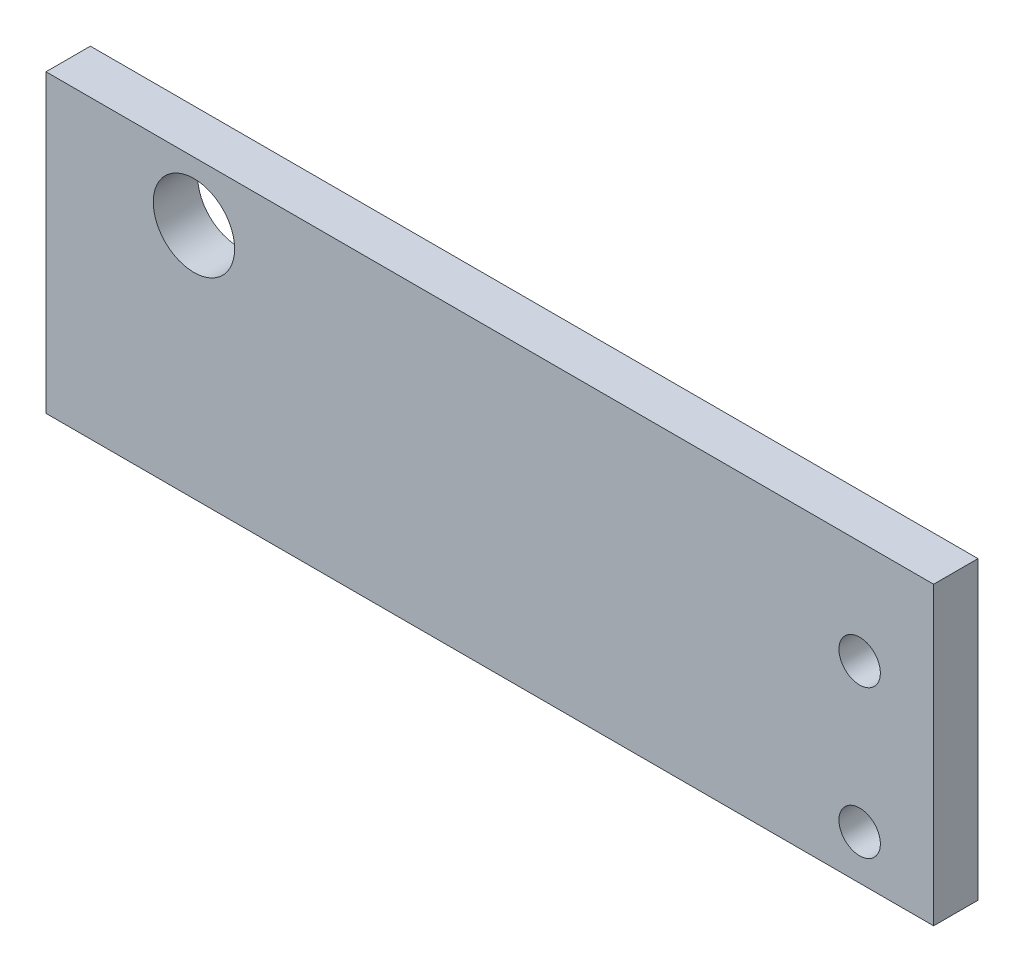
ISO-10303-21;
HEADER;
FILE_DESCRIPTION(('STEP AP214'),'2;1');
FILE_NAME('part.step','',(''),(''),'','','');
FILE_SCHEMA(('AUTOMOTIVE_DESIGN { 1 0 10303 214 1 1 1 1 }'));
ENDSEC;
DATA;
#1=APPLICATION_CONTEXT('core data for automotive mechanical design processes');
#2=APPLICATION_PROTOCOL_DEFINITION('international standard','automotive_design',2000,#1);
#3=PRODUCT_CONTEXT('',#1,'mechanical');
#4=PRODUCT('Part','Part','',(#3));
#5=PRODUCT_RELATED_PRODUCT_CATEGORY('part','',(#4));
#6=PRODUCT_DEFINITION_FORMATION('','',#4);
#7=PRODUCT_DEFINITION_CONTEXT('part definition',#1,'design');
#8=PRODUCT_DEFINITION('design','',#6,#7);
#9=PRODUCT_DEFINITION_SHAPE('','',#8);
#10=(LENGTH_UNIT() NAMED_UNIT(*) SI_UNIT(.MILLI.,.METRE.));
#11=(NAMED_UNIT(*) PLANE_ANGLE_UNIT() SI_UNIT($,.RADIAN.));
#12=(NAMED_UNIT(*) SI_UNIT($,.STERADIAN.) SOLID_ANGLE_UNIT());
#13=UNCERTAINTY_MEASURE_WITH_UNIT(LENGTH_MEASURE(1.E-05),#10,'distance_accuracy_value','');
#14=(GEOMETRIC_REPRESENTATION_CONTEXT(3) GLOBAL_UNCERTAINTY_ASSIGNED_CONTEXT((#13)) GLOBAL_UNIT_ASSIGNED_CONTEXT((#10,
#11,#12)) REPRESENTATION_CONTEXT('',''));
#15=CARTESIAN_POINT('',(0.,0.,0.));
#16=DIRECTION('',(0.,0.,1.));
#17=DIRECTION('',(1.,0.,0.));
#18=AXIS2_PLACEMENT_3D('',#15,#16,#17);
#19=CARTESIAN_POINT('',(0.,0.,3.));
#20=DIRECTION('',(0.,0.,1.));
#21=DIRECTION('',(1.,0.,0.));
#22=AXIS2_PLACEMENT_3D('',#19,#20,#21);
#23=PLANE('',#22);
#24=CARTESIAN_POINT('',(30.6451612903225,8.96774193548388,3.));
#25=DIRECTION('',(0.,0.,1.));
#26=DIRECTION('',(1.,0.,0.));
#27=AXIS2_PLACEMENT_3D('',#24,#25,#26);
#28=CIRCLE('',#27,1.4);
#29=CARTESIAN_POINT('',(32.0451612903225,8.96774193548388,3.));
#30=VERTEX_POINT('',#29);
#31=EDGE_CURVE('E140',#30,#30,#28,.T.);
#32=ORIENTED_EDGE('',*,*,#31,.F.);
#33=EDGE_LOOP('',(#32));
#34=FACE_BOUND('',#33,.T.);
#35=DIRECTION('',(0.,-1.,0.));
#36=VECTOR('',#35,1.);
#37=CARTESIAN_POINT('',(-24.3548387096774,15.9677419354839,3.));
#38=LINE('',#37,#36);
#39=CARTESIAN_POINT('',(-24.3548387096774,15.9677419354839,3.));
#40=VERTEX_POINT('',#39);
#41=CARTESIAN_POINT('',(-24.3548387096774,-4.03225806451613,3.));
#42=VERTEX_POINT('',#41);
#43=EDGE_CURVE('E98',#40,#42,#38,.T.);
#44=ORIENTED_EDGE('',*,*,#43,.T.);
#45=DIRECTION('',(1.,0.,0.));
#46=VECTOR('',#45,1.);
#47=CARTESIAN_POINT('',(-24.3548387096774,-4.03225806451613,3.));
#48=LINE('',#47,#46);
#49=CARTESIAN_POINT('',(35.6451612903226,-4.03225806451613,3.));
#50=VERTEX_POINT('',#49);
#51=EDGE_CURVE('E93',#42,#50,#48,.T.);
#52=ORIENTED_EDGE('',*,*,#51,.T.);
#53=DIRECTION('',(0.,1.,0.));
#54=VECTOR('',#53,1.);
#55=CARTESIAN_POINT('',(35.6451612903226,15.9677419354839,3.));
#56=LINE('',#55,#54);
#57=CARTESIAN_POINT('',(35.6451612903226,15.9677419354839,3.));
#58=VERTEX_POINT('',#57);
#59=EDGE_CURVE('E96',#50,#58,#56,.T.);
#60=ORIENTED_EDGE('',*,*,#59,.T.);
#61=DIRECTION('',(-1.,0.,0.));
#62=VECTOR('',#61,1.);
#63=CARTESIAN_POINT('',(-24.3548387096774,15.9677419354839,3.));
#64=LINE('',#63,#62);
#65=EDGE_CURVE('E63',#58,#40,#64,.T.);
#66=ORIENTED_EDGE('',*,*,#65,.T.);
#67=EDGE_LOOP('',(#44,#52,#60,#66));
#68=FACE_BOUND('',#67,.T.);
#69=CARTESIAN_POINT('',(-14.3548387096774,11.9677419354839,3.));
#70=DIRECTION('',(0.,0.,1.));
#71=DIRECTION('',(1.,0.,0.));
#72=AXIS2_PLACEMENT_3D('',#69,#70,#71);
#73=CIRCLE('',#72,2.75);
#74=CARTESIAN_POINT('',(-11.6048387096774,11.9677419354839,3.));
#75=VERTEX_POINT('',#74);
#76=EDGE_CURVE('E118',#75,#75,#73,.T.);
#77=ORIENTED_EDGE('',*,*,#76,.F.);
#78=EDGE_LOOP('',(#77));
#79=FACE_BOUND('',#78,.T.);
#80=CARTESIAN_POINT('',(30.6451612903226,-1.03225806451612,3.));
#81=DIRECTION('',(0.,0.,1.));
#82=DIRECTION('',(1.,0.,0.));
#83=AXIS2_PLACEMENT_3D('',#80,#81,#82);
#84=CIRCLE('',#83,1.4);
#85=CARTESIAN_POINT('',(32.0451612903226,-1.03225806451612,3.));
#86=VERTEX_POINT('',#85);
#87=EDGE_CURVE('E148',#86,#86,#84,.T.);
#88=ORIENTED_EDGE('',*,*,#87,.F.);
#89=EDGE_LOOP('',(#88));
#90=FACE_BOUND('',#89,.T.);
#91=ADVANCED_FACE('F45',(#34,#68,#79,#90),#23,.T.);
#92=CARTESIAN_POINT('',(0.,0.,0.));
#93=DIRECTION('',(0.,0.,1.));
#94=DIRECTION('',(1.,0.,0.));
#95=AXIS2_PLACEMENT_3D('',#92,#93,#94);
#96=PLANE('',#95);
#97=DIRECTION('',(0.,-1.,0.));
#98=VECTOR('',#97,1.);
#99=CARTESIAN_POINT('',(-24.3548387096774,15.9677419354839,0.));
#100=LINE('',#99,#98);
#101=CARTESIAN_POINT('',(-24.3548387096774,15.9677419354839,0.));
#102=VERTEX_POINT('',#101);
#103=CARTESIAN_POINT('',(-24.3548387096774,-4.03225806451613,0.));
#104=VERTEX_POINT('',#103);
#105=EDGE_CURVE('E114',#102,#104,#100,.T.);
#106=ORIENTED_EDGE('',*,*,#105,.F.);
#107=DIRECTION('',(-1.,0.,0.));
#108=VECTOR('',#107,1.);
#109=CARTESIAN_POINT('',(-24.3548387096774,15.9677419354839,0.));
#110=LINE('',#109,#108);
#111=CARTESIAN_POINT('',(35.6451612903226,15.9677419354839,0.));
#112=VERTEX_POINT('',#111);
#113=EDGE_CURVE('E86',#112,#102,#110,.T.);
#114=ORIENTED_EDGE('',*,*,#113,.F.);
#115=DIRECTION('',(0.,1.,0.));
#116=VECTOR('',#115,1.);
#117=CARTESIAN_POINT('',(35.6451612903226,15.9677419354839,0.));
#118=LINE('',#117,#116);
#119=CARTESIAN_POINT('',(35.6451612903226,-4.03225806451613,0.));
#120=VERTEX_POINT('',#119);
#121=EDGE_CURVE('E80',#120,#112,#118,.T.);
#122=ORIENTED_EDGE('',*,*,#121,.F.);
#123=DIRECTION('',(1.,0.,0.));
#124=VECTOR('',#123,1.);
#125=CARTESIAN_POINT('',(-24.3548387096774,-4.03225806451613,0.));
#126=LINE('',#125,#124);
#127=EDGE_CURVE('E103',#104,#120,#126,.T.);
#128=ORIENTED_EDGE('',*,*,#127,.F.);
#129=EDGE_LOOP('',(#106,#114,#122,#128));
#130=FACE_BOUND('',#129,.T.);
#131=CARTESIAN_POINT('',(-14.3548387096774,11.9677419354839,0.));
#132=DIRECTION('',(0.,0.,1.));
#133=DIRECTION('',(1.,0.,0.));
#134=AXIS2_PLACEMENT_3D('',#131,#132,#133);
#135=CIRCLE('',#134,2.75);
#136=CARTESIAN_POINT('',(-11.6048387096774,11.9677419354839,0.));
#137=VERTEX_POINT('',#136);
#138=EDGE_CURVE('E136',#137,#137,#135,.T.);
#139=ORIENTED_EDGE('',*,*,#138,.T.);
#140=EDGE_LOOP('',(#139));
#141=FACE_BOUND('',#140,.T.);
#142=CARTESIAN_POINT('',(30.6451612903225,8.96774193548388,0.));
#143=DIRECTION('',(0.,0.,1.));
#144=DIRECTION('',(1.,0.,0.));
#145=AXIS2_PLACEMENT_3D('',#142,#143,#144);
#146=CIRCLE('',#145,1.4);
#147=CARTESIAN_POINT('',(32.0451612903225,8.96774193548388,0.));
#148=VERTEX_POINT('',#147);
#149=EDGE_CURVE('E144',#148,#148,#146,.T.);
#150=ORIENTED_EDGE('',*,*,#149,.T.);
#151=EDGE_LOOP('',(#150));
#152=FACE_BOUND('',#151,.T.);
#153=CARTESIAN_POINT('',(30.6451612903226,-1.03225806451612,0.));
#154=DIRECTION('',(0.,0.,1.));
#155=DIRECTION('',(1.,0.,0.));
#156=AXIS2_PLACEMENT_3D('',#153,#154,#155);
#157=CIRCLE('',#156,1.4);
#158=CARTESIAN_POINT('',(32.0451612903226,-1.03225806451612,0.));
#159=VERTEX_POINT('',#158);
#160=EDGE_CURVE('E152',#159,#159,#157,.T.);
#161=ORIENTED_EDGE('',*,*,#160,.T.);
#162=EDGE_LOOP('',(#161));
#163=FACE_BOUND('',#162,.T.);
#164=ADVANCED_FACE('F131',(#130,#141,#152,#163),#96,.F.);
#165=CARTESIAN_POINT('',(-24.3548387096774,15.9677419354839,3.));
#166=DIRECTION('',(1.,0.,0.));
#167=DIRECTION('',(0.,1.,0.));
#168=AXIS2_PLACEMENT_3D('',#165,#166,#167);
#169=PLANE('',#168);
#170=ORIENTED_EDGE('',*,*,#105,.T.);
#171=DIRECTION('',(0.,0.,-1.));
#172=VECTOR('',#171,1.);
#173=CARTESIAN_POINT('',(-24.3548387096774,-4.03225806451613,3.));
#174=LINE('',#173,#172);
#175=EDGE_CURVE('E11',#42,#104,#174,.T.);
#176=ORIENTED_EDGE('',*,*,#175,.F.);
#177=ORIENTED_EDGE('',*,*,#43,.F.);
#178=DIRECTION('',(0.,0.,-1.));
#179=VECTOR('',#178,1.);
#180=CARTESIAN_POINT('',(-24.3548387096774,15.9677419354839,3.));
#181=LINE('',#180,#179);
#182=EDGE_CURVE('E110',#40,#102,#181,.T.);
#183=ORIENTED_EDGE('',*,*,#182,.T.);
#184=EDGE_LOOP('',(#170,#176,#177,#183));
#185=FACE_BOUND('',#184,.T.);
#186=ADVANCED_FACE('F47',(#185),#169,.F.);
#187=CARTESIAN_POINT('',(-24.3548387096774,-4.03225806451613,3.));
#188=DIRECTION('',(0.,1.,0.));
#189=DIRECTION('',(0.,0.,1.));
#190=AXIS2_PLACEMENT_3D('',#187,#188,#189);
#191=PLANE('',#190);
#192=ORIENTED_EDGE('',*,*,#127,.T.);
#193=DIRECTION('',(0.,0.,-1.));
#194=VECTOR('',#193,1.);
#195=CARTESIAN_POINT('',(35.6451612903226,-4.03225806451613,3.));
#196=LINE('',#195,#194);
#197=EDGE_CURVE('E55',#50,#120,#196,.T.);
#198=ORIENTED_EDGE('',*,*,#197,.F.);
#199=ORIENTED_EDGE('',*,*,#51,.F.);
#200=ORIENTED_EDGE('',*,*,#175,.T.);
#201=EDGE_LOOP('',(#192,#198,#199,#200));
#202=FACE_BOUND('',#201,.T.);
#203=ADVANCED_FACE('F102',(#202),#191,.F.);
#204=CARTESIAN_POINT('',(35.6451612903226,15.9677419354839,3.));
#205=DIRECTION('',(-1.,0.,0.));
#206=DIRECTION('',(0.,0.,1.));
#207=AXIS2_PLACEMENT_3D('',#204,#205,#206);
#208=PLANE('',#207);
#209=ORIENTED_EDGE('',*,*,#121,.T.);
#210=DIRECTION('',(0.,0.,-1.));
#211=VECTOR('',#210,1.);
#212=CARTESIAN_POINT('',(35.6451612903226,15.9677419354839,3.));
#213=LINE('',#212,#211);
#214=EDGE_CURVE('E105',#58,#112,#213,.T.);
#215=ORIENTED_EDGE('',*,*,#214,.F.);
#216=ORIENTED_EDGE('',*,*,#59,.F.);
#217=ORIENTED_EDGE('',*,*,#197,.T.);
#218=EDGE_LOOP('',(#209,#215,#216,#217));
#219=FACE_BOUND('',#218,.T.);
#220=ADVANCED_FACE('F106',(#219),#208,.F.);
#221=CARTESIAN_POINT('',(-24.3548387096774,15.9677419354839,3.));
#222=DIRECTION('',(0.,-1.,0.));
#223=DIRECTION('',(0.,0.,-1.));
#224=AXIS2_PLACEMENT_3D('',#221,#222,#223);
#225=PLANE('',#224);
#226=ORIENTED_EDGE('',*,*,#113,.T.);
#227=ORIENTED_EDGE('',*,*,#182,.F.);
#228=ORIENTED_EDGE('',*,*,#65,.F.);
#229=ORIENTED_EDGE('',*,*,#214,.T.);
#230=EDGE_LOOP('',(#226,#227,#228,#229));
#231=FACE_BOUND('',#230,.T.);
#232=ADVANCED_FACE('F128',(#231),#225,.F.);
#233=CARTESIAN_POINT('',(-14.3548387096774,11.9677419354839,3.));
#234=DIRECTION('',(0.,0.,-1.));
#235=DIRECTION('',(-1.,0.,0.));
#236=AXIS2_PLACEMENT_3D('',#233,#234,#235);
#237=CYLINDRICAL_SURFACE('',#236,2.75);
#238=ORIENTED_EDGE('',*,*,#76,.T.);
#239=EDGE_LOOP('',(#238));
#240=FACE_BOUND('',#239,.T.);
#241=ORIENTED_EDGE('',*,*,#138,.F.);
#242=EDGE_LOOP('',(#241));
#243=FACE_BOUND('',#242,.T.);
#244=ADVANCED_FACE('F172',(#240,#243),#237,.F.);
#245=CARTESIAN_POINT('',(30.6451612903225,8.96774193548388,3.));
#246=DIRECTION('',(0.,0.,-1.));
#247=DIRECTION('',(-1.,0.,0.));
#248=AXIS2_PLACEMENT_3D('',#245,#246,#247);
#249=CYLINDRICAL_SURFACE('',#248,1.4);
#250=ORIENTED_EDGE('',*,*,#31,.T.);
#251=EDGE_LOOP('',(#250));
#252=FACE_BOUND('',#251,.T.);
#253=ORIENTED_EDGE('',*,*,#149,.F.);
#254=EDGE_LOOP('',(#253));
#255=FACE_BOUND('',#254,.T.);
#256=ADVANCED_FACE('F217',(#252,#255),#249,.F.);
#257=CARTESIAN_POINT('',(30.6451612903226,-1.03225806451612,3.));
#258=DIRECTION('',(0.,0.,-1.));
#259=DIRECTION('',(-1.,0.,0.));
#260=AXIS2_PLACEMENT_3D('',#257,#258,#259);
#261=CYLINDRICAL_SURFACE('',#260,1.4);
#262=ORIENTED_EDGE('',*,*,#87,.T.);
#263=EDGE_LOOP('',(#262));
#264=FACE_BOUND('',#263,.T.);
#265=ORIENTED_EDGE('',*,*,#160,.F.);
#266=EDGE_LOOP('',(#265));
#267=FACE_BOUND('',#266,.T.);
#268=ADVANCED_FACE('F160',(#264,#267),#261,.F.);
#269=CLOSED_SHELL('',(#91,#164,#186,#203,#220,#232,#244,#256,#268));
#270=MANIFOLD_SOLID_BREP('B2',#269);
#271=ADVANCED_BREP_SHAPE_REPRESENTATION('',(#18,#270),#14);
#272=SHAPE_DEFINITION_REPRESENTATION(#9,#271);
ENDSEC;
END-ISO-10303-21;
